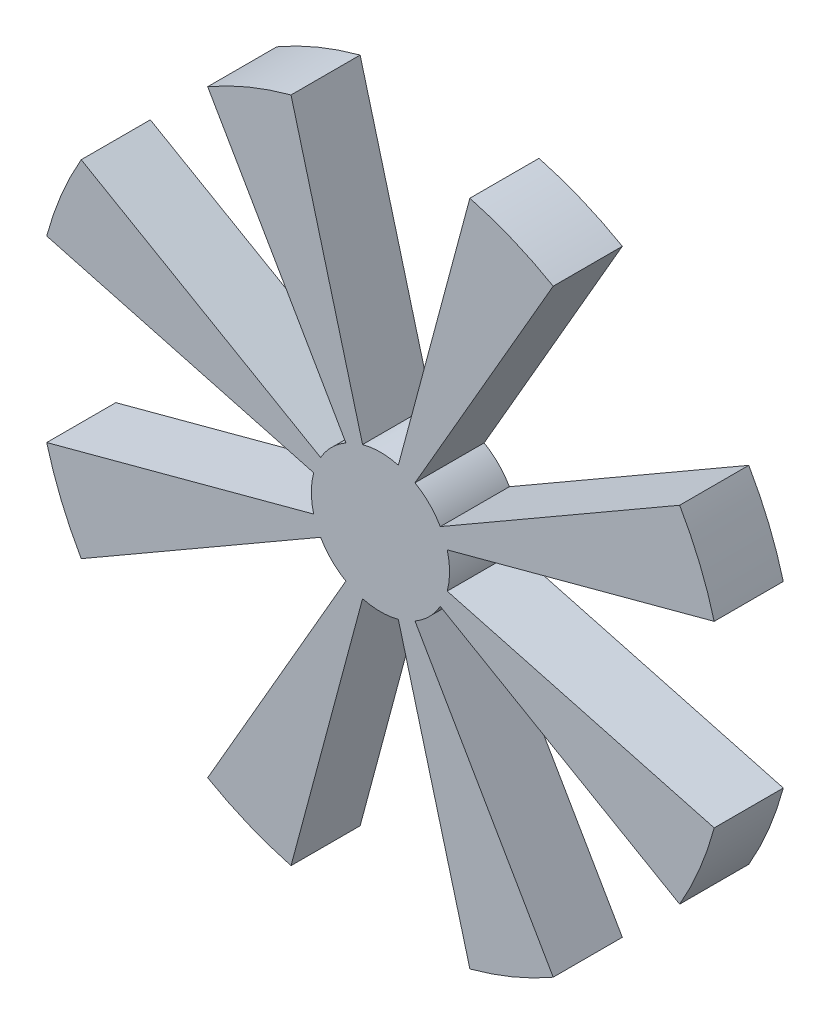
ISO-10303-21;
HEADER;
FILE_DESCRIPTION(('STEP AP214'),'2;1');
FILE_NAME('part.step','',(''),(''),'','','');
FILE_SCHEMA(('AUTOMOTIVE_DESIGN { 1 0 10303 214 1 1 1 1 }'));
ENDSEC;
DATA;
#1=APPLICATION_CONTEXT('core data for automotive mechanical design processes');
#2=APPLICATION_PROTOCOL_DEFINITION('international standard','automotive_design',2000,#1);
#3=PRODUCT_CONTEXT('',#1,'mechanical');
#4=PRODUCT('Part','Part','',(#3));
#5=PRODUCT_RELATED_PRODUCT_CATEGORY('part','',(#4));
#6=PRODUCT_DEFINITION_FORMATION('','',#4);
#7=PRODUCT_DEFINITION_CONTEXT('part definition',#1,'design');
#8=PRODUCT_DEFINITION('design','',#6,#7);
#9=PRODUCT_DEFINITION_SHAPE('','',#8);
#10=(LENGTH_UNIT() NAMED_UNIT(*) SI_UNIT(.MILLI.,.METRE.));
#11=(NAMED_UNIT(*) PLANE_ANGLE_UNIT() SI_UNIT($,.RADIAN.));
#12=(NAMED_UNIT(*) SI_UNIT($,.STERADIAN.) SOLID_ANGLE_UNIT());
#13=UNCERTAINTY_MEASURE_WITH_UNIT(LENGTH_MEASURE(1.E-05),#10,'distance_accuracy_value','');
#14=(GEOMETRIC_REPRESENTATION_CONTEXT(3) GLOBAL_UNCERTAINTY_ASSIGNED_CONTEXT((#13)) GLOBAL_UNIT_ASSIGNED_CONTEXT((#10,
#11,#12)) REPRESENTATION_CONTEXT('',''));
#15=CARTESIAN_POINT('',(0.,0.,0.));
#16=DIRECTION('',(0.,0.,1.));
#17=DIRECTION('',(1.,0.,0.));
#18=AXIS2_PLACEMENT_3D('',#15,#16,#17);
#19=CARTESIAN_POINT('',(0.,0.,5.));
#20=DIRECTION('',(0.,0.,-1.));
#21=DIRECTION('',(-1.,0.,0.));
#22=AXIS2_PLACEMENT_3D('',#19,#20,#21);
#23=CYLINDRICAL_SURFACE('',#22,5.);
#24=DIRECTION('',(0.,0.,-1.));
#25=VECTOR('',#24,1.);
#26=CARTESIAN_POINT('',(-1.29409522551254,4.82962913144536,5.));
#27=LINE('',#26,#25);
#28=CARTESIAN_POINT('',(-1.29409522551254,4.82962913144536,5.));
#29=VERTEX_POINT('',#28);
#30=CARTESIAN_POINT('',(-1.29409522551254,4.82962913144536,0.));
#31=VERTEX_POINT('',#30);
#32=EDGE_CURVE('E60',#29,#31,#27,.T.);
#33=ORIENTED_EDGE('',*,*,#32,.F.);
#34=CARTESIAN_POINT('',(0.,0.,5.));
#35=DIRECTION('',(0.,0.,1.));
#36=DIRECTION('',(1.,0.,0.));
#37=AXIS2_PLACEMENT_3D('',#34,#35,#36);
#38=CIRCLE('',#37,5.);
#39=CARTESIAN_POINT('',(1.29409522551261,4.82962913144534,5.));
#40=VERTEX_POINT('',#39);
#41=EDGE_CURVE('E439',#40,#29,#38,.T.);
#42=ORIENTED_EDGE('',*,*,#41,.F.);
#43=DIRECTION('',(0.,0.,-1.));
#44=VECTOR('',#43,1.);
#45=CARTESIAN_POINT('',(1.29409522551261,4.82962913144534,5.));
#46=LINE('',#45,#44);
#47=CARTESIAN_POINT('',(1.29409522551261,4.82962913144534,0.));
#48=VERTEX_POINT('',#47);
#49=EDGE_CURVE('E39',#40,#48,#46,.T.);
#50=ORIENTED_EDGE('',*,*,#49,.T.);
#51=CARTESIAN_POINT('',(0.,0.,0.));
#52=DIRECTION('',(0.,0.,1.));
#53=DIRECTION('',(1.,0.,0.));
#54=AXIS2_PLACEMENT_3D('',#51,#52,#53);
#55=CIRCLE('',#54,5.);
#56=EDGE_CURVE('E443',#48,#31,#55,.T.);
#57=ORIENTED_EDGE('',*,*,#56,.T.);
#58=EDGE_LOOP('',(#33,#42,#50,#57));
#59=FACE_BOUND('',#58,.T.);
#60=ADVANCED_FACE('F35',(#59),#23,.T.);
#61=CARTESIAN_POINT('',(-2.49999999999994,4.33012701892223,5.));
#62=VERTEX_POINT('',#61);
#63=CARTESIAN_POINT('',(-4.33012701892216,2.50000000000005,5.));
#64=VERTEX_POINT('',#63);
#65=EDGE_CURVE('E52',#62,#64,#38,.T.);
#66=ORIENTED_EDGE('',*,*,#65,.F.);
#67=DIRECTION('',(0.,0.,-1.));
#68=VECTOR('',#67,1.);
#69=CARTESIAN_POINT('',(-2.49999999999994,4.33012701892223,5.));
#70=LINE('',#69,#68);
#71=CARTESIAN_POINT('',(-2.49999999999994,4.33012701892223,0.));
#72=VERTEX_POINT('',#71);
#73=EDGE_CURVE('E268',#62,#72,#70,.T.);
#74=ORIENTED_EDGE('',*,*,#73,.T.);
#75=CARTESIAN_POINT('',(-4.33012701892216,2.50000000000005,0.));
#76=VERTEX_POINT('',#75);
#77=EDGE_CURVE('E445',#72,#76,#55,.T.);
#78=ORIENTED_EDGE('',*,*,#77,.T.);
#79=DIRECTION('',(0.,0.,-1.));
#80=VECTOR('',#79,1.);
#81=CARTESIAN_POINT('',(-4.33012701892216,2.50000000000005,5.));
#82=LINE('',#81,#80);
#83=EDGE_CURVE('E298',#64,#76,#82,.T.);
#84=ORIENTED_EDGE('',*,*,#83,.F.);
#85=EDGE_LOOP('',(#66,#74,#78,#84));
#86=FACE_BOUND('',#85,.T.);
#87=ADVANCED_FACE('F486',(#86),#23,.T.);
#88=CARTESIAN_POINT('',(-4.82962913144533,1.29409522551266,5.));
#89=VERTEX_POINT('',#88);
#90=CARTESIAN_POINT('',(-4.82962913144535,-1.29409522551256,5.));
#91=VERTEX_POINT('',#90);
#92=EDGE_CURVE('E869',#89,#91,#38,.T.);
#93=ORIENTED_EDGE('',*,*,#92,.F.);
#94=DIRECTION('',(0.,0.,-1.));
#95=VECTOR('',#94,1.);
#96=CARTESIAN_POINT('',(-4.82962913144533,1.29409522551266,5.));
#97=LINE('',#96,#95);
#98=CARTESIAN_POINT('',(-4.82962913144533,1.29409522551266,0.));
#99=VERTEX_POINT('',#98);
#100=EDGE_CURVE('E291',#89,#99,#97,.T.);
#101=ORIENTED_EDGE('',*,*,#100,.T.);
#102=CARTESIAN_POINT('',(-4.82962913144535,-1.29409522551256,0.));
#103=VERTEX_POINT('',#102);
#104=EDGE_CURVE('E882',#99,#103,#55,.T.);
#105=ORIENTED_EDGE('',*,*,#104,.T.);
#106=DIRECTION('',(0.,0.,-1.));
#107=VECTOR('',#106,1.);
#108=CARTESIAN_POINT('',(-4.82962913144535,-1.29409522551256,5.));
#109=LINE('',#108,#107);
#110=EDGE_CURVE('E324',#91,#103,#109,.T.);
#111=ORIENTED_EDGE('',*,*,#110,.F.);
#112=EDGE_LOOP('',(#93,#101,#105,#111));
#113=FACE_BOUND('',#112,.T.);
#114=ADVANCED_FACE('F492',(#113),#23,.T.);
#115=CARTESIAN_POINT('',(-4.33012701892222,-2.49999999999996,5.));
#116=VERTEX_POINT('',#115);
#117=CARTESIAN_POINT('',(-2.50000000000001,-4.33012701892219,5.));
#118=VERTEX_POINT('',#117);
#119=EDGE_CURVE('E874',#116,#118,#38,.T.);
#120=ORIENTED_EDGE('',*,*,#119,.F.);
#121=DIRECTION('',(0.,0.,-1.));
#122=VECTOR('',#121,1.);
#123=CARTESIAN_POINT('',(-4.33012701892222,-2.49999999999996,5.));
#124=LINE('',#123,#122);
#125=CARTESIAN_POINT('',(-4.33012701892222,-2.49999999999996,0.));
#126=VERTEX_POINT('',#125);
#127=EDGE_CURVE('E317',#116,#126,#124,.T.);
#128=ORIENTED_EDGE('',*,*,#127,.T.);
#129=CARTESIAN_POINT('',(-2.50000000000001,-4.33012701892219,0.));
#130=VERTEX_POINT('',#129);
#131=EDGE_CURVE('E884',#126,#130,#55,.T.);
#132=ORIENTED_EDGE('',*,*,#131,.T.);
#133=DIRECTION('',(0.,0.,-1.));
#134=VECTOR('',#133,1.);
#135=CARTESIAN_POINT('',(-2.50000000000001,-4.33012701892219,5.));
#136=LINE('',#135,#134);
#137=EDGE_CURVE('E350',#118,#130,#136,.T.);
#138=ORIENTED_EDGE('',*,*,#137,.F.);
#139=EDGE_LOOP('',(#120,#128,#132,#138));
#140=FACE_BOUND('',#139,.T.);
#141=ADVANCED_FACE('F798',(#140),#23,.T.);
#142=CARTESIAN_POINT('',(-1.29409522551261,-4.82962913144534,5.));
#143=VERTEX_POINT('',#142);
#144=CARTESIAN_POINT('',(1.29409522551257,-4.82962913144535,5.));
#145=VERTEX_POINT('',#144);
#146=EDGE_CURVE('E898',#143,#145,#38,.T.);
#147=ORIENTED_EDGE('',*,*,#146,.F.);
#148=DIRECTION('',(0.,0.,-1.));
#149=VECTOR('',#148,1.);
#150=CARTESIAN_POINT('',(-1.29409522551261,-4.82962913144534,5.));
#151=LINE('',#150,#149);
#152=CARTESIAN_POINT('',(-1.29409522551261,-4.82962913144534,0.));
#153=VERTEX_POINT('',#152);
#154=EDGE_CURVE('E343',#143,#153,#151,.T.);
#155=ORIENTED_EDGE('',*,*,#154,.T.);
#156=CARTESIAN_POINT('',(1.29409522551257,-4.82962913144535,0.));
#157=VERTEX_POINT('',#156);
#158=EDGE_CURVE('E541',#153,#157,#55,.T.);
#159=ORIENTED_EDGE('',*,*,#158,.T.);
#160=DIRECTION('',(0.,0.,-1.));
#161=VECTOR('',#160,1.);
#162=CARTESIAN_POINT('',(1.29409522551257,-4.82962913144535,5.));
#163=LINE('',#162,#161);
#164=EDGE_CURVE('E376',#145,#157,#163,.T.);
#165=ORIENTED_EDGE('',*,*,#164,.F.);
#166=EDGE_LOOP('',(#147,#155,#159,#165));
#167=FACE_BOUND('',#166,.T.);
#168=ADVANCED_FACE('F518',(#167),#23,.T.);
#169=CARTESIAN_POINT('',(2.49999999999997,-4.33012701892221,5.));
#170=VERTEX_POINT('',#169);
#171=CARTESIAN_POINT('',(4.33012701892218,-2.50000000000002,5.));
#172=VERTEX_POINT('',#171);
#173=EDGE_CURVE('E526',#170,#172,#38,.T.);
#174=ORIENTED_EDGE('',*,*,#173,.F.);
#175=DIRECTION('',(0.,0.,-1.));
#176=VECTOR('',#175,1.);
#177=CARTESIAN_POINT('',(2.49999999999997,-4.33012701892221,5.));
#178=LINE('',#177,#176);
#179=CARTESIAN_POINT('',(2.49999999999997,-4.33012701892221,0.));
#180=VERTEX_POINT('',#179);
#181=EDGE_CURVE('E369',#170,#180,#178,.T.);
#182=ORIENTED_EDGE('',*,*,#181,.T.);
#183=CARTESIAN_POINT('',(4.33012701892218,-2.50000000000002,0.));
#184=VERTEX_POINT('',#183);
#185=EDGE_CURVE('E540',#180,#184,#55,.T.);
#186=ORIENTED_EDGE('',*,*,#185,.T.);
#187=DIRECTION('',(0.,0.,-1.));
#188=VECTOR('',#187,1.);
#189=CARTESIAN_POINT('',(4.33012701892218,-2.50000000000002,5.));
#190=LINE('',#189,#188);
#191=EDGE_CURVE('E402',#172,#184,#190,.T.);
#192=ORIENTED_EDGE('',*,*,#191,.F.);
#193=EDGE_LOOP('',(#174,#182,#186,#192));
#194=FACE_BOUND('',#193,.T.);
#195=ADVANCED_FACE('F509',(#194),#23,.T.);
#196=CARTESIAN_POINT('',(4.82962913144534,-1.29409522551262,5.));
#197=VERTEX_POINT('',#196);
#198=CARTESIAN_POINT('',(4.82962913144535,1.29409522551259,5.));
#199=VERTEX_POINT('',#198);
#200=EDGE_CURVE('E521',#197,#199,#38,.T.);
#201=ORIENTED_EDGE('',*,*,#200,.F.);
#202=DIRECTION('',(0.,0.,-1.));
#203=VECTOR('',#202,1.);
#204=CARTESIAN_POINT('',(4.82962913144534,-1.29409522551262,5.));
#205=LINE('',#204,#203);
#206=CARTESIAN_POINT('',(4.82962913144534,-1.29409522551262,0.));
#207=VERTEX_POINT('',#206);
#208=EDGE_CURVE('E395',#197,#207,#205,.T.);
#209=ORIENTED_EDGE('',*,*,#208,.T.);
#210=CARTESIAN_POINT('',(4.82962913144535,1.29409522551259,0.));
#211=VERTEX_POINT('',#210);
#212=EDGE_CURVE('E538',#207,#211,#55,.T.);
#213=ORIENTED_EDGE('',*,*,#212,.T.);
#214=DIRECTION('',(0.,0.,-1.));
#215=VECTOR('',#214,1.);
#216=CARTESIAN_POINT('',(4.82962913144535,1.29409522551259,5.));
#217=LINE('',#216,#215);
#218=EDGE_CURVE('E428',#199,#211,#217,.T.);
#219=ORIENTED_EDGE('',*,*,#218,.F.);
#220=EDGE_LOOP('',(#201,#209,#213,#219));
#221=FACE_BOUND('',#220,.T.);
#222=ADVANCED_FACE('F498',(#221),#23,.T.);
#223=CARTESIAN_POINT('',(2.50000000000001,4.33012701892219,5.));
#224=DIRECTION('',(-0.866025403784438,0.500000000000001,0.));
#225=DIRECTION('',(-0.500000000000001,-0.866025403784438,0.));
#226=AXIS2_PLACEMENT_3D('',#223,#224,#225);
#227=PLANE('',#226);
#228=DIRECTION('',(0.500000000000001,0.866025403784438,0.));
#229=VECTOR('',#228,1.);
#230=CARTESIAN_POINT('',(2.50000000000001,4.33012701892219,0.));
#231=LINE('',#230,#229);
#232=CARTESIAN_POINT('',(2.50000000000001,4.33012701892219,0.));
#233=VERTEX_POINT('',#232);
#234=CARTESIAN_POINT('',(12.5,21.650635094611,0.));
#235=VERTEX_POINT('',#234);
#236=EDGE_CURVE('E450',#233,#235,#231,.T.);
#237=ORIENTED_EDGE('',*,*,#236,.T.);
#238=DIRECTION('',(0.,0.,-1.));
#239=VECTOR('',#238,1.);
#240=CARTESIAN_POINT('',(12.5,21.650635094611,5.));
#241=LINE('',#240,#239);
#242=CARTESIAN_POINT('',(12.5,21.650635094611,5.));
#243=VERTEX_POINT('',#242);
#244=EDGE_CURVE('E44',#243,#235,#241,.T.);
#245=ORIENTED_EDGE('',*,*,#244,.F.);
#246=DIRECTION('',(0.500000000000001,0.866025403784438,0.));
#247=VECTOR('',#246,1.);
#248=CARTESIAN_POINT('',(2.50000000000001,4.33012701892219,5.));
#249=LINE('',#248,#247);
#250=CARTESIAN_POINT('',(2.50000000000001,4.33012701892219,5.));
#251=VERTEX_POINT('',#250);
#252=EDGE_CURVE('E452',#251,#243,#249,.T.);
#253=ORIENTED_EDGE('',*,*,#252,.F.);
#254=DIRECTION('',(0.,0.,-1.));
#255=VECTOR('',#254,1.);
#256=CARTESIAN_POINT('',(2.50000000000001,4.33012701892219,5.));
#257=LINE('',#256,#255);
#258=EDGE_CURVE('E11',#251,#233,#257,.T.);
#259=ORIENTED_EDGE('',*,*,#258,.T.);
#260=EDGE_LOOP('',(#237,#245,#253,#259));
#261=FACE_BOUND('',#260,.T.);
#262=ADVANCED_FACE('F508',(#261),#227,.F.);
#263=CARTESIAN_POINT('',(0.,0.,5.));
#264=DIRECTION('',(0.,0.,-1.));
#265=DIRECTION('',(-1.,0.,0.));
#266=AXIS2_PLACEMENT_3D('',#263,#264,#265);
#267=CYLINDRICAL_SURFACE('',#266,25.);
#268=CARTESIAN_POINT('',(0.,0.,0.));
#269=DIRECTION('',(0.,0.,1.));
#270=DIRECTION('',(1.,0.,0.));
#271=AXIS2_PLACEMENT_3D('',#268,#269,#270);
#272=CIRCLE('',#271,25.);
#273=CARTESIAN_POINT('',(6.47047612756304,24.1481456572267,0.));
#274=VERTEX_POINT('',#273);
#275=EDGE_CURVE('E456',#235,#274,#272,.T.);
#276=ORIENTED_EDGE('',*,*,#275,.T.);
#277=DIRECTION('',(0.,0.,-1.));
#278=VECTOR('',#277,1.);
#279=CARTESIAN_POINT('',(6.47047612756304,24.1481456572267,5.));
#280=LINE('',#279,#278);
#281=CARTESIAN_POINT('',(6.47047612756304,24.1481456572267,5.));
#282=VERTEX_POINT('',#281);
#283=EDGE_CURVE('E461',#282,#274,#280,.T.);
#284=ORIENTED_EDGE('',*,*,#283,.F.);
#285=CARTESIAN_POINT('',(0.,0.,5.));
#286=DIRECTION('',(0.,0.,1.));
#287=DIRECTION('',(1.,0.,0.));
#288=AXIS2_PLACEMENT_3D('',#285,#286,#287);
#289=CIRCLE('',#288,25.);
#290=EDGE_CURVE('E449',#243,#282,#289,.T.);
#291=ORIENTED_EDGE('',*,*,#290,.F.);
#292=ORIENTED_EDGE('',*,*,#244,.T.);
#293=EDGE_LOOP('',(#276,#284,#291,#292));
#294=FACE_BOUND('',#293,.T.);
#295=ADVANCED_FACE('F515',(#294),#267,.T.);
#296=CARTESIAN_POINT('',(1.29409522551261,4.82962913144534,5.));
#297=DIRECTION('',(-0.965925826289068,0.258819045102521,0.));
#298=DIRECTION('',(-0.258819045102521,-0.965925826289068,0.));
#299=AXIS2_PLACEMENT_3D('',#296,#297,#298);
#300=PLANE('',#299);
#301=DIRECTION('',(0.258819045102521,0.965925826289068,0.));
#302=VECTOR('',#301,1.);
#303=CARTESIAN_POINT('',(1.29409522551261,4.82962913144534,0.));
#304=LINE('',#303,#302);
#305=EDGE_CURVE('E441',#48,#274,#304,.T.);
#306=ORIENTED_EDGE('',*,*,#305,.F.);
#307=ORIENTED_EDGE('',*,*,#49,.F.);
#308=DIRECTION('',(0.258819045102521,0.965925826289068,0.));
#309=VECTOR('',#308,1.);
#310=CARTESIAN_POINT('',(1.29409522551261,4.82962913144534,5.));
#311=LINE('',#310,#309);
#312=EDGE_CURVE('E446',#40,#282,#311,.T.);
#313=ORIENTED_EDGE('',*,*,#312,.T.);
#314=ORIENTED_EDGE('',*,*,#283,.T.);
#315=EDGE_LOOP('',(#306,#307,#313,#314));
#316=FACE_BOUND('',#315,.T.);
#317=ADVANCED_FACE('F37',(#316),#300,.T.);
#318=CARTESIAN_POINT('',(0.,0.,5.));
#319=DIRECTION('',(0.,0.,1.));
#320=DIRECTION('',(1.,0.,0.));
#321=AXIS2_PLACEMENT_3D('',#318,#319,#320);
#322=PLANE('',#321);
#323=ORIENTED_EDGE('',*,*,#312,.F.);
#324=ORIENTED_EDGE('',*,*,#41,.T.);
#325=DIRECTION('',(-0.258819045102508,0.965925826289072,0.));
#326=VECTOR('',#325,1.);
#327=CARTESIAN_POINT('',(-1.29409522551254,4.82962913144536,5.));
#328=LINE('',#327,#326);
#329=CARTESIAN_POINT('',(-6.47047612756269,24.1481456572268,5.));
#330=VERTEX_POINT('',#329);
#331=EDGE_CURVE('E254',#29,#330,#328,.T.);
#332=ORIENTED_EDGE('',*,*,#331,.T.);
#333=CARTESIAN_POINT('',(0.,0.,5.));
#334=DIRECTION('',(0.,0.,1.));
#335=DIRECTION('',(0.707106781186556,0.707106781186539,0.));
#336=AXIS2_PLACEMENT_3D('',#333,#334,#335);
#337=CIRCLE('',#336,25.);
#338=CARTESIAN_POINT('',(-12.4999999999997,21.6506350946111,5.));
#339=VERTEX_POINT('',#338);
#340=EDGE_CURVE('E247',#330,#339,#337,.T.);
#341=ORIENTED_EDGE('',*,*,#340,.T.);
#342=DIRECTION('',(-0.499999999999989,0.866025403784445,0.));
#343=VECTOR('',#342,1.);
#344=CARTESIAN_POINT('',(-2.49999999999994,4.33012701892223,5.));
#345=LINE('',#344,#343);
#346=EDGE_CURVE('E252',#62,#339,#345,.T.);
#347=ORIENTED_EDGE('',*,*,#346,.F.);
#348=ORIENTED_EDGE('',*,*,#65,.T.);
#349=DIRECTION('',(-0.866025403784433,0.50000000000001,0.));
#350=VECTOR('',#349,1.);
#351=CARTESIAN_POINT('',(-4.33012701892216,2.50000000000005,5.));
#352=LINE('',#351,#350);
#353=CARTESIAN_POINT('',(-21.6506350946108,12.5000000000003,5.));
#354=VERTEX_POINT('',#353);
#355=EDGE_CURVE('E289',#64,#354,#352,.T.);
#356=ORIENTED_EDGE('',*,*,#355,.T.);
#357=CARTESIAN_POINT('',(0.,0.,5.));
#358=DIRECTION('',(0.,0.,1.));
#359=DIRECTION('',(0.,1.,0.));
#360=AXIS2_PLACEMENT_3D('',#357,#358,#359);
#361=CIRCLE('',#360,25.);
#362=CARTESIAN_POINT('',(-24.1481456572266,6.47047612756329,5.));
#363=VERTEX_POINT('',#362);
#364=EDGE_CURVE('E286',#354,#363,#361,.T.);
#365=ORIENTED_EDGE('',*,*,#364,.T.);
#366=DIRECTION('',(-0.965925826289066,0.258819045102532,0.));
#367=VECTOR('',#366,1.);
#368=CARTESIAN_POINT('',(-4.82962913144533,1.29409522551266,5.));
#369=LINE('',#368,#367);
#370=EDGE_CURVE('E283',#89,#363,#369,.T.);
#371=ORIENTED_EDGE('',*,*,#370,.F.);
#372=ORIENTED_EDGE('',*,*,#92,.T.);
#373=DIRECTION('',(-0.965925826289071,-0.258819045102511,0.));
#374=VECTOR('',#373,1.);
#375=CARTESIAN_POINT('',(-4.82962913144535,-1.29409522551256,5.));
#376=LINE('',#375,#374);
#377=CARTESIAN_POINT('',(-24.1481456572268,-6.47047612756278,5.));
#378=VERTEX_POINT('',#377);
#379=EDGE_CURVE('E315',#91,#378,#376,.T.);
#380=ORIENTED_EDGE('',*,*,#379,.T.);
#381=CARTESIAN_POINT('',(0.,0.,5.));
#382=DIRECTION('',(0.,0.,1.));
#383=DIRECTION('',(-0.707106781186541,0.707106781186554,0.));
#384=AXIS2_PLACEMENT_3D('',#381,#382,#383);
#385=CIRCLE('',#384,25.);
#386=CARTESIAN_POINT('',(-21.6506350946111,-12.4999999999998,5.));
#387=VERTEX_POINT('',#386);
#388=EDGE_CURVE('E312',#378,#387,#385,.T.);
#389=ORIENTED_EDGE('',*,*,#388,.T.);
#390=DIRECTION('',(-0.866025403784443,-0.499999999999992,0.));
#391=VECTOR('',#390,1.);
#392=CARTESIAN_POINT('',(-4.33012701892222,-2.49999999999996,5.));
#393=LINE('',#392,#391);
#394=EDGE_CURVE('E309',#116,#387,#393,.T.);
#395=ORIENTED_EDGE('',*,*,#394,.F.);
#396=ORIENTED_EDGE('',*,*,#119,.T.);
#397=DIRECTION('',(-0.500000000000001,-0.866025403784438,0.));
#398=VECTOR('',#397,1.);
#399=CARTESIAN_POINT('',(-2.50000000000001,-4.33012701892219,5.));
#400=LINE('',#399,#398);
#401=CARTESIAN_POINT('',(-12.5,-21.650635094611,5.));
#402=VERTEX_POINT('',#401);
#403=EDGE_CURVE('E341',#118,#402,#400,.T.);
#404=ORIENTED_EDGE('',*,*,#403,.T.);
#405=CARTESIAN_POINT('',(0.,0.,5.));
#406=DIRECTION('',(0.,0.,1.));
#407=DIRECTION('',(-1.,0.,0.));
#408=AXIS2_PLACEMENT_3D('',#405,#406,#407);
#409=CIRCLE('',#408,25.);
#410=CARTESIAN_POINT('',(-6.47047612756304,-24.1481456572267,5.));
#411=VERTEX_POINT('',#410);
#412=EDGE_CURVE('E338',#402,#411,#409,.T.);
#413=ORIENTED_EDGE('',*,*,#412,.T.);
#414=DIRECTION('',(-0.258819045102521,-0.965925826289068,0.));
#415=VECTOR('',#414,1.);
#416=CARTESIAN_POINT('',(-1.29409522551261,-4.82962913144534,5.));
#417=LINE('',#416,#415);
#418=EDGE_CURVE('E335',#143,#411,#417,.T.);
#419=ORIENTED_EDGE('',*,*,#418,.F.);
#420=ORIENTED_EDGE('',*,*,#146,.T.);
#421=DIRECTION('',(0.258819045102514,-0.96592582628907,0.));
#422=VECTOR('',#421,1.);
#423=CARTESIAN_POINT('',(1.29409522551257,-4.82962913144535,5.));
#424=LINE('',#423,#422);
#425=CARTESIAN_POINT('',(6.47047612756286,-24.1481456572268,5.));
#426=VERTEX_POINT('',#425);
#427=EDGE_CURVE('E367',#145,#426,#424,.T.);
#428=ORIENTED_EDGE('',*,*,#427,.T.);
#429=CARTESIAN_POINT('',(0.,0.,5.));
#430=DIRECTION('',(0.,0.,1.));
#431=DIRECTION('',(-0.707106781186551,-0.707106781186544,0.));
#432=AXIS2_PLACEMENT_3D('',#429,#430,#431);
#433=CIRCLE('',#432,25.);
#434=CARTESIAN_POINT('',(12.4999999999999,-21.650635094611,5.));
#435=VERTEX_POINT('',#434);
#436=EDGE_CURVE('E364',#426,#435,#433,.T.);
#437=ORIENTED_EDGE('',*,*,#436,.T.);
#438=DIRECTION('',(0.499999999999995,-0.866025403784442,0.));
#439=VECTOR('',#438,1.);
#440=CARTESIAN_POINT('',(2.49999999999997,-4.33012701892221,5.));
#441=LINE('',#440,#439);
#442=EDGE_CURVE('E361',#170,#435,#441,.T.);
#443=ORIENTED_EDGE('',*,*,#442,.F.);
#444=ORIENTED_EDGE('',*,*,#173,.T.);
#445=DIRECTION('',(0.866025403784436,-0.500000000000004,0.));
#446=VECTOR('',#445,1.);
#447=CARTESIAN_POINT('',(4.33012701892218,-2.50000000000002,5.));
#448=LINE('',#447,#446);
#449=CARTESIAN_POINT('',(21.6506350946109,-12.5000000000001,5.));
#450=VERTEX_POINT('',#449);
#451=EDGE_CURVE('E393',#172,#450,#448,.T.);
#452=ORIENTED_EDGE('',*,*,#451,.T.);
#453=CARTESIAN_POINT('',(0.,0.,5.));
#454=DIRECTION('',(0.,0.,1.));
#455=DIRECTION('',(0.,-1.,0.));
#456=AXIS2_PLACEMENT_3D('',#453,#454,#455);
#457=CIRCLE('',#456,25.);
#458=CARTESIAN_POINT('',(24.1481456572267,-6.47047612756312,5.));
#459=VERTEX_POINT('',#458);
#460=EDGE_CURVE('E390',#450,#459,#457,.T.);
#461=ORIENTED_EDGE('',*,*,#460,.T.);
#462=DIRECTION('',(0.965925826289067,-0.258819045102525,0.));
#463=VECTOR('',#462,1.);
#464=CARTESIAN_POINT('',(4.82962913144534,-1.29409522551262,5.));
#465=LINE('',#464,#463);
#466=EDGE_CURVE('E387',#197,#459,#465,.T.);
#467=ORIENTED_EDGE('',*,*,#466,.F.);
#468=ORIENTED_EDGE('',*,*,#200,.T.);
#469=DIRECTION('',(0.965925826289069,0.258819045102518,0.));
#470=VECTOR('',#469,1.);
#471=CARTESIAN_POINT('',(4.82962913144535,1.29409522551259,5.));
#472=LINE('',#471,#470);
#473=CARTESIAN_POINT('',(24.1481456572267,6.47047612756295,5.));
#474=VERTEX_POINT('',#473);
#475=EDGE_CURVE('E419',#199,#474,#472,.T.);
#476=ORIENTED_EDGE('',*,*,#475,.T.);
#477=CARTESIAN_POINT('',(0.,0.,5.));
#478=DIRECTION('',(0.,0.,1.));
#479=DIRECTION('',(0.707106781186546,-0.707106781186549,0.));
#480=AXIS2_PLACEMENT_3D('',#477,#478,#479);
#481=CIRCLE('',#480,25.);
#482=CARTESIAN_POINT('',(21.650635094611,12.5,5.));
#483=VERTEX_POINT('',#482);
#484=EDGE_CURVE('E416',#474,#483,#481,.T.);
#485=ORIENTED_EDGE('',*,*,#484,.T.);
#486=DIRECTION('',(0.86602540378444,0.499999999999998,0.));
#487=VECTOR('',#486,1.);
#488=CARTESIAN_POINT('',(4.3301270189222,2.49999999999999,5.));
#489=LINE('',#488,#487);
#490=CARTESIAN_POINT('',(4.3301270189222,2.49999999999999,5.));
#491=VERTEX_POINT('',#490);
#492=EDGE_CURVE('E413',#491,#483,#489,.T.);
#493=ORIENTED_EDGE('',*,*,#492,.F.);
#494=EDGE_CURVE('E442',#491,#251,#38,.T.);
#495=ORIENTED_EDGE('',*,*,#494,.T.);
#496=ORIENTED_EDGE('',*,*,#252,.T.);
#497=ORIENTED_EDGE('',*,*,#290,.T.);
#498=EDGE_LOOP('',(#323,#324,#332,#341,#347,#348,#356,#365,#371,#372,#380,#389,#395,#396,#404,
#413,#419,#420,#428,#437,#443,#444,#452,#461,#467,#468,#476,#485,#493,#495,#496,#497));
#499=FACE_BOUND('',#498,.T.);
#500=ADVANCED_FACE('F250',(#499),#322,.T.);
#501=CARTESIAN_POINT('',(0.,0.,0.));
#502=DIRECTION('',(0.,0.,1.));
#503=DIRECTION('',(1.,0.,0.));
#504=AXIS2_PLACEMENT_3D('',#501,#502,#503);
#505=PLANE('',#504);
#506=ORIENTED_EDGE('',*,*,#236,.F.);
#507=CARTESIAN_POINT('',(4.3301270189222,2.49999999999999,0.));
#508=VERTEX_POINT('',#507);
#509=EDGE_CURVE('E431',#508,#233,#55,.T.);
#510=ORIENTED_EDGE('',*,*,#509,.F.);
#511=DIRECTION('',(0.86602540378444,0.499999999999998,0.));
#512=VECTOR('',#511,1.);
#513=CARTESIAN_POINT('',(4.3301270189222,2.49999999999999,0.));
#514=LINE('',#513,#512);
#515=CARTESIAN_POINT('',(21.650635094611,12.5,0.));
#516=VERTEX_POINT('',#515);
#517=EDGE_CURVE('E405',#508,#516,#514,.T.);
#518=ORIENTED_EDGE('',*,*,#517,.T.);
#519=CARTESIAN_POINT('',(0.,0.,0.));
#520=DIRECTION('',(0.,0.,1.));
#521=DIRECTION('',(0.707106781186546,-0.707106781186549,0.));
#522=AXIS2_PLACEMENT_3D('',#519,#520,#521);
#523=CIRCLE('',#522,25.);
#524=CARTESIAN_POINT('',(24.1481456572267,6.47047612756295,0.));
#525=VERTEX_POINT('',#524);
#526=EDGE_CURVE('E424',#525,#516,#523,.T.);
#527=ORIENTED_EDGE('',*,*,#526,.F.);
#528=DIRECTION('',(0.965925826289069,0.258819045102518,0.));
#529=VECTOR('',#528,1.);
#530=CARTESIAN_POINT('',(4.82962913144535,1.29409522551259,0.));
#531=LINE('',#530,#529);
#532=EDGE_CURVE('E417',#211,#525,#531,.T.);
#533=ORIENTED_EDGE('',*,*,#532,.F.);
#534=ORIENTED_EDGE('',*,*,#212,.F.);
#535=DIRECTION('',(0.965925826289067,-0.258819045102525,0.));
#536=VECTOR('',#535,1.);
#537=CARTESIAN_POINT('',(4.82962913144534,-1.29409522551262,0.));
#538=LINE('',#537,#536);
#539=CARTESIAN_POINT('',(24.1481456572267,-6.47047612756312,0.));
#540=VERTEX_POINT('',#539);
#541=EDGE_CURVE('E379',#207,#540,#538,.T.);
#542=ORIENTED_EDGE('',*,*,#541,.T.);
#543=CARTESIAN_POINT('',(0.,0.,0.));
#544=DIRECTION('',(0.,0.,1.));
#545=DIRECTION('',(0.,-1.,0.));
#546=AXIS2_PLACEMENT_3D('',#543,#544,#545);
#547=CIRCLE('',#546,25.);
#548=CARTESIAN_POINT('',(21.6506350946109,-12.5000000000001,0.));
#549=VERTEX_POINT('',#548);
#550=EDGE_CURVE('E398',#549,#540,#547,.T.);
#551=ORIENTED_EDGE('',*,*,#550,.F.);
#552=DIRECTION('',(0.866025403784436,-0.500000000000004,0.));
#553=VECTOR('',#552,1.);
#554=CARTESIAN_POINT('',(4.33012701892218,-2.50000000000002,0.));
#555=LINE('',#554,#553);
#556=EDGE_CURVE('E391',#184,#549,#555,.T.);
#557=ORIENTED_EDGE('',*,*,#556,.F.);
#558=ORIENTED_EDGE('',*,*,#185,.F.);
#559=DIRECTION('',(0.499999999999995,-0.866025403784442,0.));
#560=VECTOR('',#559,1.);
#561=CARTESIAN_POINT('',(2.49999999999997,-4.33012701892221,0.));
#562=LINE('',#561,#560);
#563=CARTESIAN_POINT('',(12.4999999999999,-21.650635094611,0.));
#564=VERTEX_POINT('',#563);
#565=EDGE_CURVE('E353',#180,#564,#562,.T.);
#566=ORIENTED_EDGE('',*,*,#565,.T.);
#567=CARTESIAN_POINT('',(0.,0.,0.));
#568=DIRECTION('',(0.,0.,1.));
#569=DIRECTION('',(-0.707106781186551,-0.707106781186544,0.));
#570=AXIS2_PLACEMENT_3D('',#567,#568,#569);
#571=CIRCLE('',#570,25.);
#572=CARTESIAN_POINT('',(6.47047612756286,-24.1481456572268,0.));
#573=VERTEX_POINT('',#572);
#574=EDGE_CURVE('E372',#573,#564,#571,.T.);
#575=ORIENTED_EDGE('',*,*,#574,.F.);
#576=DIRECTION('',(0.258819045102514,-0.96592582628907,0.));
#577=VECTOR('',#576,1.);
#578=CARTESIAN_POINT('',(1.29409522551257,-4.82962913144535,0.));
#579=LINE('',#578,#577);
#580=EDGE_CURVE('E365',#157,#573,#579,.T.);
#581=ORIENTED_EDGE('',*,*,#580,.F.);
#582=ORIENTED_EDGE('',*,*,#158,.F.);
#583=DIRECTION('',(-0.258819045102521,-0.965925826289068,0.));
#584=VECTOR('',#583,1.);
#585=CARTESIAN_POINT('',(-1.29409522551261,-4.82962913144534,0.));
#586=LINE('',#585,#584);
#587=CARTESIAN_POINT('',(-6.47047612756304,-24.1481456572267,0.));
#588=VERTEX_POINT('',#587);
#589=EDGE_CURVE('E327',#153,#588,#586,.T.);
#590=ORIENTED_EDGE('',*,*,#589,.T.);
#591=CARTESIAN_POINT('',(0.,0.,0.));
#592=DIRECTION('',(0.,0.,1.));
#593=DIRECTION('',(-1.,0.,0.));
#594=AXIS2_PLACEMENT_3D('',#591,#592,#593);
#595=CIRCLE('',#594,25.);
#596=CARTESIAN_POINT('',(-12.5,-21.650635094611,0.));
#597=VERTEX_POINT('',#596);
#598=EDGE_CURVE('E346',#597,#588,#595,.T.);
#599=ORIENTED_EDGE('',*,*,#598,.F.);
#600=DIRECTION('',(-0.500000000000001,-0.866025403784438,0.));
#601=VECTOR('',#600,1.);
#602=CARTESIAN_POINT('',(-2.50000000000001,-4.33012701892219,0.));
#603=LINE('',#602,#601);
#604=EDGE_CURVE('E339',#130,#597,#603,.T.);
#605=ORIENTED_EDGE('',*,*,#604,.F.);
#606=ORIENTED_EDGE('',*,*,#131,.F.);
#607=DIRECTION('',(-0.866025403784443,-0.499999999999992,0.));
#608=VECTOR('',#607,1.);
#609=CARTESIAN_POINT('',(-4.33012701892222,-2.49999999999996,0.));
#610=LINE('',#609,#608);
#611=CARTESIAN_POINT('',(-21.6506350946111,-12.4999999999998,0.));
#612=VERTEX_POINT('',#611);
#613=EDGE_CURVE('E301',#126,#612,#610,.T.);
#614=ORIENTED_EDGE('',*,*,#613,.T.);
#615=CARTESIAN_POINT('',(0.,0.,0.));
#616=DIRECTION('',(0.,0.,1.));
#617=DIRECTION('',(-0.707106781186541,0.707106781186554,0.));
#618=AXIS2_PLACEMENT_3D('',#615,#616,#617);
#619=CIRCLE('',#618,25.);
#620=CARTESIAN_POINT('',(-24.1481456572268,-6.47047612756278,0.));
#621=VERTEX_POINT('',#620);
#622=EDGE_CURVE('E320',#621,#612,#619,.T.);
#623=ORIENTED_EDGE('',*,*,#622,.F.);
#624=DIRECTION('',(-0.965925826289071,-0.258819045102511,0.));
#625=VECTOR('',#624,1.);
#626=CARTESIAN_POINT('',(-4.82962913144535,-1.29409522551256,0.));
#627=LINE('',#626,#625);
#628=EDGE_CURVE('E313',#103,#621,#627,.T.);
#629=ORIENTED_EDGE('',*,*,#628,.F.);
#630=ORIENTED_EDGE('',*,*,#104,.F.);
#631=DIRECTION('',(-0.965925826289066,0.258819045102532,0.));
#632=VECTOR('',#631,1.);
#633=CARTESIAN_POINT('',(-4.82962913144533,1.29409522551266,0.));
#634=LINE('',#633,#632);
#635=CARTESIAN_POINT('',(-24.1481456572266,6.47047612756329,0.));
#636=VERTEX_POINT('',#635);
#637=EDGE_CURVE('E280',#99,#636,#634,.T.);
#638=ORIENTED_EDGE('',*,*,#637,.T.);
#639=CARTESIAN_POINT('',(0.,0.,0.));
#640=DIRECTION('',(0.,0.,1.));
#641=DIRECTION('',(0.,1.,0.));
#642=AXIS2_PLACEMENT_3D('',#639,#640,#641);
#643=CIRCLE('',#642,25.);
#644=CARTESIAN_POINT('',(-21.6506350946108,12.5000000000003,0.));
#645=VERTEX_POINT('',#644);
#646=EDGE_CURVE('E294',#645,#636,#643,.T.);
#647=ORIENTED_EDGE('',*,*,#646,.F.);
#648=DIRECTION('',(-0.866025403784433,0.50000000000001,0.));
#649=VECTOR('',#648,1.);
#650=CARTESIAN_POINT('',(-4.33012701892216,2.50000000000005,0.));
#651=LINE('',#650,#649);
#652=EDGE_CURVE('E287',#76,#645,#651,.T.);
#653=ORIENTED_EDGE('',*,*,#652,.F.);
#654=ORIENTED_EDGE('',*,*,#77,.F.);
#655=DIRECTION('',(-0.499999999999989,0.866025403784445,0.));
#656=VECTOR('',#655,1.);
#657=CARTESIAN_POINT('',(-2.49999999999994,4.33012701892223,0.));
#658=LINE('',#657,#656);
#659=CARTESIAN_POINT('',(-12.4999999999997,21.6506350946111,0.));
#660=VERTEX_POINT('',#659);
#661=EDGE_CURVE('E276',#72,#660,#658,.T.);
#662=ORIENTED_EDGE('',*,*,#661,.T.);
#663=CARTESIAN_POINT('',(0.,0.,0.));
#664=DIRECTION('',(0.,0.,1.));
#665=DIRECTION('',(0.707106781186556,0.707106781186539,0.));
#666=AXIS2_PLACEMENT_3D('',#663,#664,#665);
#667=CIRCLE('',#666,25.);
#668=CARTESIAN_POINT('',(-6.47047612756269,24.1481456572268,0.));
#669=VERTEX_POINT('',#668);
#670=EDGE_CURVE('E263',#669,#660,#667,.T.);
#671=ORIENTED_EDGE('',*,*,#670,.F.);
#672=DIRECTION('',(-0.258819045102508,0.965925826289072,0.));
#673=VECTOR('',#672,1.);
#674=CARTESIAN_POINT('',(-1.29409522551254,4.82962913144536,0.));
#675=LINE('',#674,#673);
#676=EDGE_CURVE('E271',#31,#669,#675,.T.);
#677=ORIENTED_EDGE('',*,*,#676,.F.);
#678=ORIENTED_EDGE('',*,*,#56,.F.);
#679=ORIENTED_EDGE('',*,*,#305,.T.);
#680=ORIENTED_EDGE('',*,*,#275,.F.);
#681=EDGE_LOOP('',(#506,#510,#518,#527,#533,#534,#542,#551,#557,#558,#566,#575,#581,#582,#590,
#599,#605,#606,#614,#623,#629,#630,#638,#647,#653,#654,#662,#671,#677,#678,#679,#680));
#682=FACE_BOUND('',#681,.T.);
#683=ADVANCED_FACE('F470',(#682),#505,.F.);
#684=ORIENTED_EDGE('',*,*,#494,.F.);
#685=DIRECTION('',(0.,0.,-1.));
#686=VECTOR('',#685,1.);
#687=CARTESIAN_POINT('',(4.3301270189222,2.49999999999999,5.));
#688=LINE('',#687,#686);
#689=EDGE_CURVE('E421',#491,#508,#688,.T.);
#690=ORIENTED_EDGE('',*,*,#689,.T.);
#691=ORIENTED_EDGE('',*,*,#509,.T.);
#692=ORIENTED_EDGE('',*,*,#258,.F.);
#693=EDGE_LOOP('',(#684,#690,#691,#692));
#694=FACE_BOUND('',#693,.T.);
#695=ADVANCED_FACE('F488',(#694),#23,.T.);
#696=CARTESIAN_POINT('',(4.82962913144535,1.29409522551259,5.));
#697=DIRECTION('',(-0.258819045102518,0.965925826289069,0.));
#698=DIRECTION('',(-0.965925826289069,-0.258819045102518,0.));
#699=AXIS2_PLACEMENT_3D('',#696,#697,#698);
#700=PLANE('',#699);
#701=ORIENTED_EDGE('',*,*,#532,.T.);
#702=DIRECTION('',(0.,0.,-1.));
#703=VECTOR('',#702,1.);
#704=CARTESIAN_POINT('',(24.1481456572267,6.47047612756295,5.));
#705=LINE('',#704,#703);
#706=EDGE_CURVE('E432',#474,#525,#705,.T.);
#707=ORIENTED_EDGE('',*,*,#706,.F.);
#708=ORIENTED_EDGE('',*,*,#475,.F.);
#709=ORIENTED_EDGE('',*,*,#218,.T.);
#710=EDGE_LOOP('',(#701,#707,#708,#709));
#711=FACE_BOUND('',#710,.T.);
#712=ADVANCED_FACE('F496',(#711),#700,.F.);
#713=CARTESIAN_POINT('',(0.,0.,5.));
#714=DIRECTION('',(0.,0.,-1.));
#715=DIRECTION('',(-0.707106781186546,0.707106781186549,0.));
#716=AXIS2_PLACEMENT_3D('',#713,#714,#715);
#717=CYLINDRICAL_SURFACE('',#716,25.);
#718=ORIENTED_EDGE('',*,*,#526,.T.);
#719=DIRECTION('',(0.,0.,-1.));
#720=VECTOR('',#719,1.);
#721=CARTESIAN_POINT('',(21.650635094611,12.5,5.));
#722=LINE('',#721,#720);
#723=EDGE_CURVE('E435',#483,#516,#722,.T.);
#724=ORIENTED_EDGE('',*,*,#723,.F.);
#725=ORIENTED_EDGE('',*,*,#484,.F.);
#726=ORIENTED_EDGE('',*,*,#706,.T.);
#727=EDGE_LOOP('',(#718,#724,#725,#726));
#728=FACE_BOUND('',#727,.T.);
#729=ADVANCED_FACE('F503',(#728),#717,.T.);
#730=CARTESIAN_POINT('',(4.3301270189222,2.49999999999999,5.));
#731=DIRECTION('',(-0.499999999999998,0.86602540378444,0.));
#732=DIRECTION('',(-0.86602540378444,-0.499999999999998,0.));
#733=AXIS2_PLACEMENT_3D('',#730,#731,#732);
#734=PLANE('',#733);
#735=ORIENTED_EDGE('',*,*,#517,.F.);
#736=ORIENTED_EDGE('',*,*,#689,.F.);
#737=ORIENTED_EDGE('',*,*,#492,.T.);
#738=ORIENTED_EDGE('',*,*,#723,.T.);
#739=EDGE_LOOP('',(#735,#736,#737,#738));
#740=FACE_BOUND('',#739,.T.);
#741=ADVANCED_FACE('F550',(#740),#734,.T.);
#742=CARTESIAN_POINT('',(4.33012701892218,-2.50000000000002,5.));
#743=DIRECTION('',(0.500000000000004,0.866025403784436,0.));
#744=DIRECTION('',(-0.866025403784436,0.500000000000004,0.));
#745=AXIS2_PLACEMENT_3D('',#742,#743,#744);
#746=PLANE('',#745);
#747=ORIENTED_EDGE('',*,*,#556,.T.);
#748=DIRECTION('',(0.,0.,-1.));
#749=VECTOR('',#748,1.);
#750=CARTESIAN_POINT('',(21.6506350946109,-12.5000000000001,5.));
#751=LINE('',#750,#749);
#752=EDGE_CURVE('E406',#450,#549,#751,.T.);
#753=ORIENTED_EDGE('',*,*,#752,.F.);
#754=ORIENTED_EDGE('',*,*,#451,.F.);
#755=ORIENTED_EDGE('',*,*,#191,.T.);
#756=EDGE_LOOP('',(#747,#753,#754,#755));
#757=FACE_BOUND('',#756,.T.);
#758=ADVANCED_FACE('F560',(#757),#746,.F.);
#759=CARTESIAN_POINT('',(0.,0.,5.));
#760=DIRECTION('',(0.,0.,-1.));
#761=DIRECTION('',(0.,1.,0.));
#762=AXIS2_PLACEMENT_3D('',#759,#760,#761);
#763=CYLINDRICAL_SURFACE('',#762,25.);
#764=ORIENTED_EDGE('',*,*,#550,.T.);
#765=DIRECTION('',(0.,0.,-1.));
#766=VECTOR('',#765,1.);
#767=CARTESIAN_POINT('',(24.1481456572267,-6.47047612756312,5.));
#768=LINE('',#767,#766);
#769=EDGE_CURVE('E409',#459,#540,#768,.T.);
#770=ORIENTED_EDGE('',*,*,#769,.F.);
#771=ORIENTED_EDGE('',*,*,#460,.F.);
#772=ORIENTED_EDGE('',*,*,#752,.T.);
#773=EDGE_LOOP('',(#764,#770,#771,#772));
#774=FACE_BOUND('',#773,.T.);
#775=ADVANCED_FACE('F534',(#774),#763,.T.);
#776=CARTESIAN_POINT('',(4.82962913144534,-1.29409522551262,5.));
#777=DIRECTION('',(0.258819045102525,0.965925826289067,0.));
#778=DIRECTION('',(-0.965925826289067,0.258819045102525,0.));
#779=AXIS2_PLACEMENT_3D('',#776,#777,#778);
#780=PLANE('',#779);
#781=ORIENTED_EDGE('',*,*,#541,.F.);
#782=ORIENTED_EDGE('',*,*,#208,.F.);
#783=ORIENTED_EDGE('',*,*,#466,.T.);
#784=ORIENTED_EDGE('',*,*,#769,.T.);
#785=EDGE_LOOP('',(#781,#782,#783,#784));
#786=FACE_BOUND('',#785,.T.);
#787=ADVANCED_FACE('F528',(#786),#780,.T.);
#788=CARTESIAN_POINT('',(1.29409522551257,-4.82962913144535,5.));
#789=DIRECTION('',(0.96592582628907,0.258819045102514,0.));
#790=DIRECTION('',(-0.258819045102514,0.96592582628907,0.));
#791=AXIS2_PLACEMENT_3D('',#788,#789,#790);
#792=PLANE('',#791);
#793=ORIENTED_EDGE('',*,*,#580,.T.);
#794=DIRECTION('',(0.,0.,-1.));
#795=VECTOR('',#794,1.);
#796=CARTESIAN_POINT('',(6.47047612756286,-24.1481456572268,5.));
#797=LINE('',#796,#795);
#798=EDGE_CURVE('E380',#426,#573,#797,.T.);
#799=ORIENTED_EDGE('',*,*,#798,.F.);
#800=ORIENTED_EDGE('',*,*,#427,.F.);
#801=ORIENTED_EDGE('',*,*,#164,.T.);
#802=EDGE_LOOP('',(#793,#799,#800,#801));
#803=FACE_BOUND('',#802,.T.);
#804=ADVANCED_FACE('F564',(#803),#792,.F.);
#805=CARTESIAN_POINT('',(0.,0.,5.));
#806=DIRECTION('',(0.,0.,-1.));
#807=DIRECTION('',(0.707106781186551,0.707106781186544,0.));
#808=AXIS2_PLACEMENT_3D('',#805,#806,#807);
#809=CYLINDRICAL_SURFACE('',#808,25.);
#810=ORIENTED_EDGE('',*,*,#574,.T.);
#811=DIRECTION('',(0.,0.,-1.));
#812=VECTOR('',#811,1.);
#813=CARTESIAN_POINT('',(12.4999999999999,-21.650635094611,5.));
#814=LINE('',#813,#812);
#815=EDGE_CURVE('E383',#435,#564,#814,.T.);
#816=ORIENTED_EDGE('',*,*,#815,.F.);
#817=ORIENTED_EDGE('',*,*,#436,.F.);
#818=ORIENTED_EDGE('',*,*,#798,.T.);
#819=EDGE_LOOP('',(#810,#816,#817,#818));
#820=FACE_BOUND('',#819,.T.);
#821=ADVANCED_FACE('F574',(#820),#809,.T.);
#822=CARTESIAN_POINT('',(2.49999999999997,-4.33012701892221,5.));
#823=DIRECTION('',(0.866025403784442,0.499999999999995,0.));
#824=DIRECTION('',(-0.499999999999995,0.866025403784442,0.));
#825=AXIS2_PLACEMENT_3D('',#822,#823,#824);
#826=PLANE('',#825);
#827=ORIENTED_EDGE('',*,*,#565,.F.);
#828=ORIENTED_EDGE('',*,*,#181,.F.);
#829=ORIENTED_EDGE('',*,*,#442,.T.);
#830=ORIENTED_EDGE('',*,*,#815,.T.);
#831=EDGE_LOOP('',(#827,#828,#829,#830));
#832=FACE_BOUND('',#831,.T.);
#833=ADVANCED_FACE('F570',(#832),#826,.T.);
#834=CARTESIAN_POINT('',(-2.50000000000001,-4.33012701892219,5.));
#835=DIRECTION('',(0.866025403784438,-0.500000000000001,0.));
#836=DIRECTION('',(0.500000000000001,0.866025403784438,0.));
#837=AXIS2_PLACEMENT_3D('',#834,#835,#836);
#838=PLANE('',#837);
#839=ORIENTED_EDGE('',*,*,#604,.T.);
#840=DIRECTION('',(0.,0.,-1.));
#841=VECTOR('',#840,1.);
#842=CARTESIAN_POINT('',(-12.5,-21.650635094611,5.));
#843=LINE('',#842,#841);
#844=EDGE_CURVE('E354',#402,#597,#843,.T.);
#845=ORIENTED_EDGE('',*,*,#844,.F.);
#846=ORIENTED_EDGE('',*,*,#403,.F.);
#847=ORIENTED_EDGE('',*,*,#137,.T.);
#848=EDGE_LOOP('',(#839,#845,#846,#847));
#849=FACE_BOUND('',#848,.T.);
#850=ADVANCED_FACE('F573',(#849),#838,.F.);
#851=CARTESIAN_POINT('',(0.,0.,5.));
#852=DIRECTION('',(0.,0.,-1.));
#853=DIRECTION('',(1.,0.,0.));
#854=AXIS2_PLACEMENT_3D('',#851,#852,#853);
#855=CYLINDRICAL_SURFACE('',#854,25.);
#856=ORIENTED_EDGE('',*,*,#598,.T.);
#857=DIRECTION('',(0.,0.,-1.));
#858=VECTOR('',#857,1.);
#859=CARTESIAN_POINT('',(-6.47047612756304,-24.1481456572267,5.));
#860=LINE('',#859,#858);
#861=EDGE_CURVE('E357',#411,#588,#860,.T.);
#862=ORIENTED_EDGE('',*,*,#861,.F.);
#863=ORIENTED_EDGE('',*,*,#412,.F.);
#864=ORIENTED_EDGE('',*,*,#844,.T.);
#865=EDGE_LOOP('',(#856,#862,#863,#864));
#866=FACE_BOUND('',#865,.T.);
#867=ADVANCED_FACE('F586',(#866),#855,.T.);
#868=CARTESIAN_POINT('',(-1.29409522551261,-4.82962913144534,5.));
#869=DIRECTION('',(0.965925826289068,-0.258819045102521,0.));
#870=DIRECTION('',(0.258819045102521,0.965925826289068,0.));
#871=AXIS2_PLACEMENT_3D('',#868,#869,#870);
#872=PLANE('',#871);
#873=ORIENTED_EDGE('',*,*,#589,.F.);
#874=ORIENTED_EDGE('',*,*,#154,.F.);
#875=ORIENTED_EDGE('',*,*,#418,.T.);
#876=ORIENTED_EDGE('',*,*,#861,.T.);
#877=EDGE_LOOP('',(#873,#874,#875,#876));
#878=FACE_BOUND('',#877,.T.);
#879=ADVANCED_FACE('F582',(#878),#872,.T.);
#880=CARTESIAN_POINT('',(-4.82962913144535,-1.29409522551256,5.));
#881=DIRECTION('',(0.258819045102511,-0.965925826289071,0.));
#882=DIRECTION('',(0.965925826289071,0.258819045102511,0.));
#883=AXIS2_PLACEMENT_3D('',#880,#881,#882);
#884=PLANE('',#883);
#885=ORIENTED_EDGE('',*,*,#628,.T.);
#886=DIRECTION('',(0.,0.,-1.));
#887=VECTOR('',#886,1.);
#888=CARTESIAN_POINT('',(-24.1481456572268,-6.47047612756278,5.));
#889=LINE('',#888,#887);
#890=EDGE_CURVE('E328',#378,#621,#889,.T.);
#891=ORIENTED_EDGE('',*,*,#890,.F.);
#892=ORIENTED_EDGE('',*,*,#379,.F.);
#893=ORIENTED_EDGE('',*,*,#110,.T.);
#894=EDGE_LOOP('',(#885,#891,#892,#893));
#895=FACE_BOUND('',#894,.T.);
#896=ADVANCED_FACE('F585',(#895),#884,.F.);
#897=CARTESIAN_POINT('',(0.,0.,5.));
#898=DIRECTION('',(0.,0.,-1.));
#899=DIRECTION('',(0.707106781186541,-0.707106781186554,0.));
#900=AXIS2_PLACEMENT_3D('',#897,#898,#899);
#901=CYLINDRICAL_SURFACE('',#900,25.);
#902=ORIENTED_EDGE('',*,*,#622,.T.);
#903=DIRECTION('',(0.,0.,-1.));
#904=VECTOR('',#903,1.);
#905=CARTESIAN_POINT('',(-21.6506350946111,-12.4999999999998,5.));
#906=LINE('',#905,#904);
#907=EDGE_CURVE('E331',#387,#612,#906,.T.);
#908=ORIENTED_EDGE('',*,*,#907,.F.);
#909=ORIENTED_EDGE('',*,*,#388,.F.);
#910=ORIENTED_EDGE('',*,*,#890,.T.);
#911=EDGE_LOOP('',(#902,#908,#909,#910));
#912=FACE_BOUND('',#911,.T.);
#913=ADVANCED_FACE('F598',(#912),#901,.T.);
#914=CARTESIAN_POINT('',(-4.33012701892222,-2.49999999999996,5.));
#915=DIRECTION('',(0.499999999999992,-0.866025403784443,0.));
#916=DIRECTION('',(0.866025403784443,0.499999999999992,0.));
#917=AXIS2_PLACEMENT_3D('',#914,#915,#916);
#918=PLANE('',#917);
#919=ORIENTED_EDGE('',*,*,#613,.F.);
#920=ORIENTED_EDGE('',*,*,#127,.F.);
#921=ORIENTED_EDGE('',*,*,#394,.T.);
#922=ORIENTED_EDGE('',*,*,#907,.T.);
#923=EDGE_LOOP('',(#919,#920,#921,#922));
#924=FACE_BOUND('',#923,.T.);
#925=ADVANCED_FACE('F594',(#924),#918,.T.);
#926=CARTESIAN_POINT('',(-4.33012701892216,2.50000000000005,5.));
#927=DIRECTION('',(-0.50000000000001,-0.866025403784433,0.));
#928=DIRECTION('',(0.866025403784433,-0.50000000000001,0.));
#929=AXIS2_PLACEMENT_3D('',#926,#927,#928);
#930=PLANE('',#929);
#931=ORIENTED_EDGE('',*,*,#652,.T.);
#932=DIRECTION('',(0.,0.,-1.));
#933=VECTOR('',#932,1.);
#934=CARTESIAN_POINT('',(-21.6506350946108,12.5000000000003,5.));
#935=LINE('',#934,#933);
#936=EDGE_CURVE('E302',#354,#645,#935,.T.);
#937=ORIENTED_EDGE('',*,*,#936,.F.);
#938=ORIENTED_EDGE('',*,*,#355,.F.);
#939=ORIENTED_EDGE('',*,*,#83,.T.);
#940=EDGE_LOOP('',(#931,#937,#938,#939));
#941=FACE_BOUND('',#940,.T.);
#942=ADVANCED_FACE('F597',(#941),#930,.F.);
#943=CARTESIAN_POINT('',(0.,0.,5.));
#944=DIRECTION('',(0.,0.,-1.));
#945=DIRECTION('',(0.,-1.,0.));
#946=AXIS2_PLACEMENT_3D('',#943,#944,#945);
#947=CYLINDRICAL_SURFACE('',#946,25.);
#948=ORIENTED_EDGE('',*,*,#646,.T.);
#949=DIRECTION('',(0.,0.,-1.));
#950=VECTOR('',#949,1.);
#951=CARTESIAN_POINT('',(-24.1481456572266,6.47047612756329,5.));
#952=LINE('',#951,#950);
#953=EDGE_CURVE('E305',#363,#636,#952,.T.);
#954=ORIENTED_EDGE('',*,*,#953,.F.);
#955=ORIENTED_EDGE('',*,*,#364,.F.);
#956=ORIENTED_EDGE('',*,*,#936,.T.);
#957=EDGE_LOOP('',(#948,#954,#955,#956));
#958=FACE_BOUND('',#957,.T.);
#959=ADVANCED_FACE('F482',(#958),#947,.T.);
#960=CARTESIAN_POINT('',(-4.82962913144533,1.29409522551266,5.));
#961=DIRECTION('',(-0.258819045102532,-0.965925826289066,0.));
#962=DIRECTION('',(0.965925826289066,-0.258819045102532,0.));
#963=AXIS2_PLACEMENT_3D('',#960,#961,#962);
#964=PLANE('',#963);
#965=ORIENTED_EDGE('',*,*,#637,.F.);
#966=ORIENTED_EDGE('',*,*,#100,.F.);
#967=ORIENTED_EDGE('',*,*,#370,.T.);
#968=ORIENTED_EDGE('',*,*,#953,.T.);
#969=EDGE_LOOP('',(#965,#966,#967,#968));
#970=FACE_BOUND('',#969,.T.);
#971=ADVANCED_FACE('F475',(#970),#964,.T.);
#972=CARTESIAN_POINT('',(-1.29409522551254,4.82962913144536,5.));
#973=DIRECTION('',(-0.965925826289072,-0.258819045102508,0.));
#974=DIRECTION('',(0.258819045102508,-0.965925826289072,0.));
#975=AXIS2_PLACEMENT_3D('',#972,#973,#974);
#976=PLANE('',#975);
#977=ORIENTED_EDGE('',*,*,#676,.T.);
#978=DIRECTION('',(0.,0.,-1.));
#979=VECTOR('',#978,1.);
#980=CARTESIAN_POINT('',(-6.47047612756269,24.1481456572268,5.));
#981=LINE('',#980,#979);
#982=EDGE_CURVE('E267',#330,#669,#981,.T.);
#983=ORIENTED_EDGE('',*,*,#982,.F.);
#984=ORIENTED_EDGE('',*,*,#331,.F.);
#985=ORIENTED_EDGE('',*,*,#32,.T.);
#986=EDGE_LOOP('',(#977,#983,#984,#985));
#987=FACE_BOUND('',#986,.T.);
#988=ADVANCED_FACE('F473',(#987),#976,.F.);
#989=CARTESIAN_POINT('',(0.,0.,5.));
#990=DIRECTION('',(0.,0.,-1.));
#991=DIRECTION('',(-0.707106781186556,-0.707106781186539,0.));
#992=AXIS2_PLACEMENT_3D('',#989,#990,#991);
#993=CYLINDRICAL_SURFACE('',#992,25.);
#994=ORIENTED_EDGE('',*,*,#670,.T.);
#995=DIRECTION('',(0.,0.,-1.));
#996=VECTOR('',#995,1.);
#997=CARTESIAN_POINT('',(-12.4999999999997,21.6506350946111,5.));
#998=LINE('',#997,#996);
#999=EDGE_CURVE('E260',#339,#660,#998,.T.);
#1000=ORIENTED_EDGE('',*,*,#999,.F.);
#1001=ORIENTED_EDGE('',*,*,#340,.F.);
#1002=ORIENTED_EDGE('',*,*,#982,.T.);
#1003=EDGE_LOOP('',(#994,#1000,#1001,#1002));
#1004=FACE_BOUND('',#1003,.T.);
#1005=ADVANCED_FACE('F261',(#1004),#993,.T.);
#1006=CARTESIAN_POINT('',(-2.49999999999994,4.33012701892223,5.));
#1007=DIRECTION('',(-0.866025403784445,-0.499999999999989,0.));
#1008=DIRECTION('',(0.499999999999989,-0.866025403784445,0.));
#1009=AXIS2_PLACEMENT_3D('',#1006,#1007,#1008);
#1010=PLANE('',#1009);
#1011=ORIENTED_EDGE('',*,*,#661,.F.);
#1012=ORIENTED_EDGE('',*,*,#73,.F.);
#1013=ORIENTED_EDGE('',*,*,#346,.T.);
#1014=ORIENTED_EDGE('',*,*,#999,.T.);
#1015=EDGE_LOOP('',(#1011,#1012,#1013,#1014));
#1016=FACE_BOUND('',#1015,.T.);
#1017=ADVANCED_FACE('F270',(#1016),#1010,.T.);
#1018=CLOSED_SHELL('',(#60,#87,#114,#141,#168,#195,#222,#262,#295,#317,#500,#683,#695,#712,#729,
#741,#758,#775,#787,#804,#821,#833,#850,#867,#879,#896,#913,#925,#942,#959,#971,#988,#1005,#1017));
#1019=MANIFOLD_SOLID_BREP('B2',#1018);
#1020=ADVANCED_BREP_SHAPE_REPRESENTATION('',(#18,#1019),#14);
#1021=SHAPE_DEFINITION_REPRESENTATION(#9,#1020);
ENDSEC;
END-ISO-10303-21;
